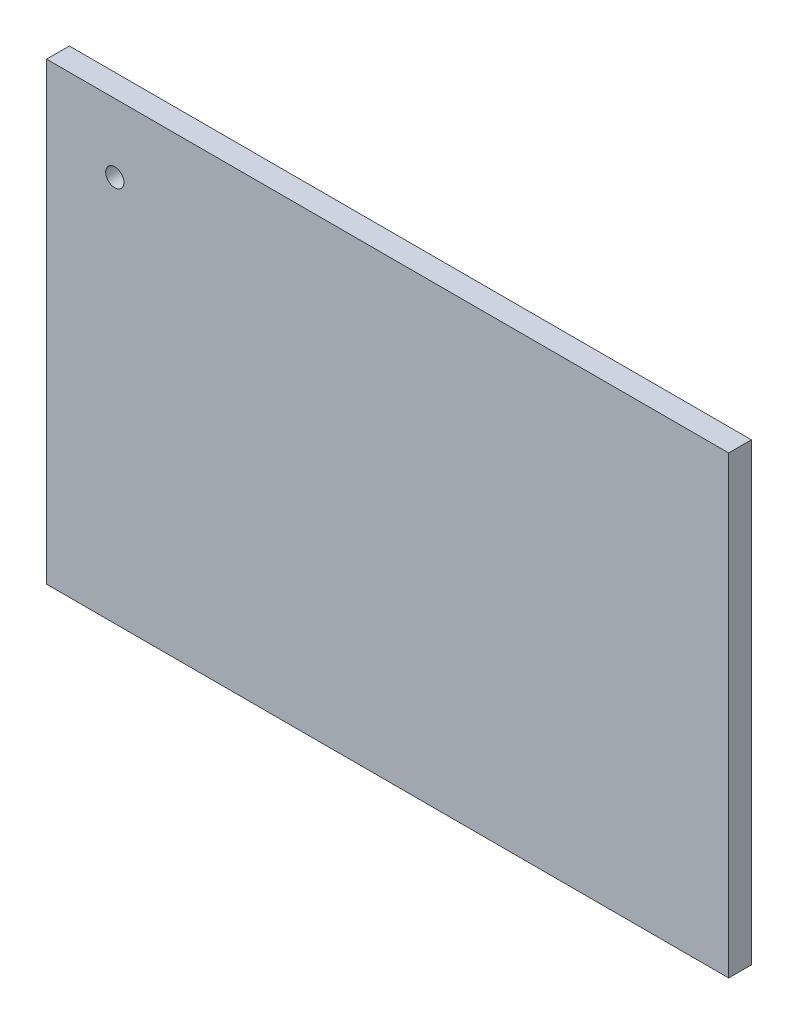
ISO-10303-21;
HEADER;
FILE_DESCRIPTION(('STEP AP214'),'2;1');
FILE_NAME('part.step','',(''),(''),'','','');
FILE_SCHEMA(('AUTOMOTIVE_DESIGN { 1 0 10303 214 1 1 1 1 }'));
ENDSEC;
DATA;
#1=APPLICATION_CONTEXT('core data for automotive mechanical design processes');
#2=APPLICATION_PROTOCOL_DEFINITION('international standard','automotive_design',2000,#1);
#3=PRODUCT_CONTEXT('',#1,'mechanical');
#4=PRODUCT('Part','Part','',(#3));
#5=PRODUCT_RELATED_PRODUCT_CATEGORY('part','',(#4));
#6=PRODUCT_DEFINITION_FORMATION('','',#4);
#7=PRODUCT_DEFINITION_CONTEXT('part definition',#1,'design');
#8=PRODUCT_DEFINITION('design','',#6,#7);
#9=PRODUCT_DEFINITION_SHAPE('','',#8);
#10=(LENGTH_UNIT() NAMED_UNIT(*) SI_UNIT(.MILLI.,.METRE.));
#11=(NAMED_UNIT(*) PLANE_ANGLE_UNIT() SI_UNIT($,.RADIAN.));
#12=(NAMED_UNIT(*) SI_UNIT($,.STERADIAN.) SOLID_ANGLE_UNIT());
#13=UNCERTAINTY_MEASURE_WITH_UNIT(LENGTH_MEASURE(1.E-05),#10,'distance_accuracy_value','');
#14=(GEOMETRIC_REPRESENTATION_CONTEXT(3) GLOBAL_UNCERTAINTY_ASSIGNED_CONTEXT((#13)) GLOBAL_UNIT_ASSIGNED_CONTEXT((#10,
#11,#12)) REPRESENTATION_CONTEXT('',''));
#15=CARTESIAN_POINT('',(0.,0.,0.));
#16=DIRECTION('',(0.,0.,1.));
#17=DIRECTION('',(1.,0.,0.));
#18=AXIS2_PLACEMENT_3D('',#15,#16,#17);
#19=CARTESIAN_POINT('',(150.,100.,10.));
#20=DIRECTION('',(-1.,0.,0.));
#21=DIRECTION('',(0.,-1.,0.));
#22=AXIS2_PLACEMENT_3D('',#19,#20,#21);
#23=PLANE('',#22);
#24=DIRECTION('',(0.,1.,0.));
#25=VECTOR('',#24,1.);
#26=CARTESIAN_POINT('',(150.,100.,0.));
#27=LINE('',#26,#25);
#28=CARTESIAN_POINT('',(150.,-100.,0.));
#29=VERTEX_POINT('',#28);
#30=CARTESIAN_POINT('',(150.,100.,0.));
#31=VERTEX_POINT('',#30);
#32=EDGE_CURVE('E107',#29,#31,#27,.T.);
#33=ORIENTED_EDGE('',*,*,#32,.T.);
#34=DIRECTION('',(0.,0.,-1.));
#35=VECTOR('',#34,1.);
#36=CARTESIAN_POINT('',(150.,100.,10.));
#37=LINE('',#36,#35);
#38=CARTESIAN_POINT('',(150.,100.,10.));
#39=VERTEX_POINT('',#38);
#40=EDGE_CURVE('E11',#39,#31,#37,.T.);
#41=ORIENTED_EDGE('',*,*,#40,.F.);
#42=DIRECTION('',(0.,1.,0.));
#43=VECTOR('',#42,1.);
#44=CARTESIAN_POINT('',(150.,100.,10.));
#45=LINE('',#44,#43);
#46=CARTESIAN_POINT('',(150.,-100.,10.));
#47=VERTEX_POINT('',#46);
#48=EDGE_CURVE('E91',#47,#39,#45,.T.);
#49=ORIENTED_EDGE('',*,*,#48,.F.);
#50=DIRECTION('',(0.,0.,-1.));
#51=VECTOR('',#50,1.);
#52=CARTESIAN_POINT('',(150.,-100.,10.));
#53=LINE('',#52,#51);
#54=EDGE_CURVE('E103',#47,#29,#53,.T.);
#55=ORIENTED_EDGE('',*,*,#54,.T.);
#56=EDGE_LOOP('',(#33,#41,#49,#55));
#57=FACE_BOUND('',#56,.T.);
#58=ADVANCED_FACE('F39',(#57),#23,.F.);
#59=CARTESIAN_POINT('',(-150.,100.,10.));
#60=DIRECTION('',(0.,-1.,0.));
#61=DIRECTION('',(0.,0.,-1.));
#62=AXIS2_PLACEMENT_3D('',#59,#60,#61);
#63=PLANE('',#62);
#64=DIRECTION('',(-1.,0.,0.));
#65=VECTOR('',#64,1.);
#66=CARTESIAN_POINT('',(-150.,100.,0.));
#67=LINE('',#66,#65);
#68=CARTESIAN_POINT('',(-150.,100.,0.));
#69=VERTEX_POINT('',#68);
#70=EDGE_CURVE('E96',#31,#69,#67,.T.);
#71=ORIENTED_EDGE('',*,*,#70,.T.);
#72=DIRECTION('',(0.,0.,-1.));
#73=VECTOR('',#72,1.);
#74=CARTESIAN_POINT('',(-150.,100.,10.));
#75=LINE('',#74,#73);
#76=CARTESIAN_POINT('',(-150.,100.,10.));
#77=VERTEX_POINT('',#76);
#78=EDGE_CURVE('E48',#77,#69,#75,.T.);
#79=ORIENTED_EDGE('',*,*,#78,.F.);
#80=DIRECTION('',(-1.,0.,0.));
#81=VECTOR('',#80,1.);
#82=CARTESIAN_POINT('',(-150.,100.,10.));
#83=LINE('',#82,#81);
#84=EDGE_CURVE('E86',#39,#77,#83,.T.);
#85=ORIENTED_EDGE('',*,*,#84,.F.);
#86=ORIENTED_EDGE('',*,*,#40,.T.);
#87=EDGE_LOOP('',(#71,#79,#85,#86));
#88=FACE_BOUND('',#87,.T.);
#89=ADVANCED_FACE('F95',(#88),#63,.F.);
#90=CARTESIAN_POINT('',(-150.,100.,10.));
#91=DIRECTION('',(1.,0.,0.));
#92=DIRECTION('',(0.,1.,0.));
#93=AXIS2_PLACEMENT_3D('',#90,#91,#92);
#94=PLANE('',#93);
#95=DIRECTION('',(0.,-1.,0.));
#96=VECTOR('',#95,1.);
#97=CARTESIAN_POINT('',(-150.,100.,0.));
#98=LINE('',#97,#96);
#99=CARTESIAN_POINT('',(-150.,-100.,0.));
#100=VERTEX_POINT('',#99);
#101=EDGE_CURVE('E73',#69,#100,#98,.T.);
#102=ORIENTED_EDGE('',*,*,#101,.T.);
#103=DIRECTION('',(0.,0.,-1.));
#104=VECTOR('',#103,1.);
#105=CARTESIAN_POINT('',(-150.,-100.,10.));
#106=LINE('',#105,#104);
#107=CARTESIAN_POINT('',(-150.,-100.,10.));
#108=VERTEX_POINT('',#107);
#109=EDGE_CURVE('E98',#108,#100,#106,.T.);
#110=ORIENTED_EDGE('',*,*,#109,.F.);
#111=DIRECTION('',(0.,-1.,0.));
#112=VECTOR('',#111,1.);
#113=CARTESIAN_POINT('',(-150.,100.,10.));
#114=LINE('',#113,#112);
#115=EDGE_CURVE('E89',#77,#108,#114,.T.);
#116=ORIENTED_EDGE('',*,*,#115,.F.);
#117=ORIENTED_EDGE('',*,*,#78,.T.);
#118=EDGE_LOOP('',(#102,#110,#116,#117));
#119=FACE_BOUND('',#118,.T.);
#120=ADVANCED_FACE('F99',(#119),#94,.F.);
#121=CARTESIAN_POINT('',(-150.,-100.,10.));
#122=DIRECTION('',(0.,1.,0.));
#123=DIRECTION('',(0.,0.,1.));
#124=AXIS2_PLACEMENT_3D('',#121,#122,#123);
#125=PLANE('',#124);
#126=DIRECTION('',(1.,0.,0.));
#127=VECTOR('',#126,1.);
#128=CARTESIAN_POINT('',(-150.,-100.,0.));
#129=LINE('',#128,#127);
#130=EDGE_CURVE('E79',#100,#29,#129,.T.);
#131=ORIENTED_EDGE('',*,*,#130,.T.);
#132=ORIENTED_EDGE('',*,*,#54,.F.);
#133=DIRECTION('',(1.,0.,0.));
#134=VECTOR('',#133,1.);
#135=CARTESIAN_POINT('',(-150.,-100.,10.));
#136=LINE('',#135,#134);
#137=EDGE_CURVE('E56',#108,#47,#136,.T.);
#138=ORIENTED_EDGE('',*,*,#137,.F.);
#139=ORIENTED_EDGE('',*,*,#109,.T.);
#140=EDGE_LOOP('',(#131,#132,#138,#139));
#141=FACE_BOUND('',#140,.T.);
#142=ADVANCED_FACE('F121',(#141),#125,.F.);
#143=CARTESIAN_POINT('',(0.,0.,10.));
#144=DIRECTION('',(0.,0.,1.));
#145=DIRECTION('',(1.,0.,0.));
#146=AXIS2_PLACEMENT_3D('',#143,#144,#145);
#147=PLANE('',#146);
#148=CARTESIAN_POINT('',(-120.,70.,10.));
#149=DIRECTION('',(0.,0.,1.));
#150=DIRECTION('',(1.,0.,0.));
#151=AXIS2_PLACEMENT_3D('',#148,#149,#150);
#152=CIRCLE('',#151,4.00000000000001);
#153=CARTESIAN_POINT('',(-116.,70.,10.));
#154=VERTEX_POINT('',#153);
#155=EDGE_CURVE('E128',#154,#154,#152,.T.);
#156=ORIENTED_EDGE('',*,*,#155,.F.);
#157=EDGE_LOOP('',(#156));
#158=FACE_BOUND('',#157,.T.);
#159=ORIENTED_EDGE('',*,*,#48,.T.);
#160=ORIENTED_EDGE('',*,*,#84,.T.);
#161=ORIENTED_EDGE('',*,*,#115,.T.);
#162=ORIENTED_EDGE('',*,*,#137,.T.);
#163=EDGE_LOOP('',(#159,#160,#161,#162));
#164=FACE_BOUND('',#163,.T.);
#165=ADVANCED_FACE('F87',(#158,#164),#147,.T.);
#166=CARTESIAN_POINT('',(0.,0.,0.));
#167=DIRECTION('',(0.,0.,1.));
#168=DIRECTION('',(1.,0.,0.));
#169=AXIS2_PLACEMENT_3D('',#166,#167,#168);
#170=PLANE('',#169);
#171=CARTESIAN_POINT('',(-120.,70.,0.));
#172=DIRECTION('',(0.,0.,1.));
#173=DIRECTION('',(1.,0.,0.));
#174=AXIS2_PLACEMENT_3D('',#171,#172,#173);
#175=CIRCLE('',#174,4.00000000000001);
#176=CARTESIAN_POINT('',(-116.,70.,0.));
#177=VERTEX_POINT('',#176);
#178=EDGE_CURVE('E111',#177,#177,#175,.T.);
#179=ORIENTED_EDGE('',*,*,#178,.T.);
#180=EDGE_LOOP('',(#179));
#181=FACE_BOUND('',#180,.T.);
#182=ORIENTED_EDGE('',*,*,#32,.F.);
#183=ORIENTED_EDGE('',*,*,#130,.F.);
#184=ORIENTED_EDGE('',*,*,#101,.F.);
#185=ORIENTED_EDGE('',*,*,#70,.F.);
#186=EDGE_LOOP('',(#182,#183,#184,#185));
#187=FACE_BOUND('',#186,.T.);
#188=ADVANCED_FACE('F124',(#181,#187),#170,.F.);
#189=CARTESIAN_POINT('',(-120.,70.,0.));
#190=DIRECTION('',(0.,0.,1.));
#191=DIRECTION('',(1.,0.,0.));
#192=AXIS2_PLACEMENT_3D('',#189,#190,#191);
#193=CYLINDRICAL_SURFACE('',#192,4.00000000000001);
#194=ORIENTED_EDGE('',*,*,#178,.F.);
#195=EDGE_LOOP('',(#194));
#196=FACE_BOUND('',#195,.T.);
#197=ORIENTED_EDGE('',*,*,#155,.T.);
#198=EDGE_LOOP('',(#197));
#199=FACE_BOUND('',#198,.T.);
#200=ADVANCED_FACE('F137',(#196,#199),#193,.F.);
#201=CLOSED_SHELL('',(#58,#89,#120,#142,#165,#188,#200));
#202=MANIFOLD_SOLID_BREP('B2',#201);
#203=ADVANCED_BREP_SHAPE_REPRESENTATION('',(#18,#202),#14);
#204=SHAPE_DEFINITION_REPRESENTATION(#9,#203);
ENDSEC;
END-ISO-10303-21;
